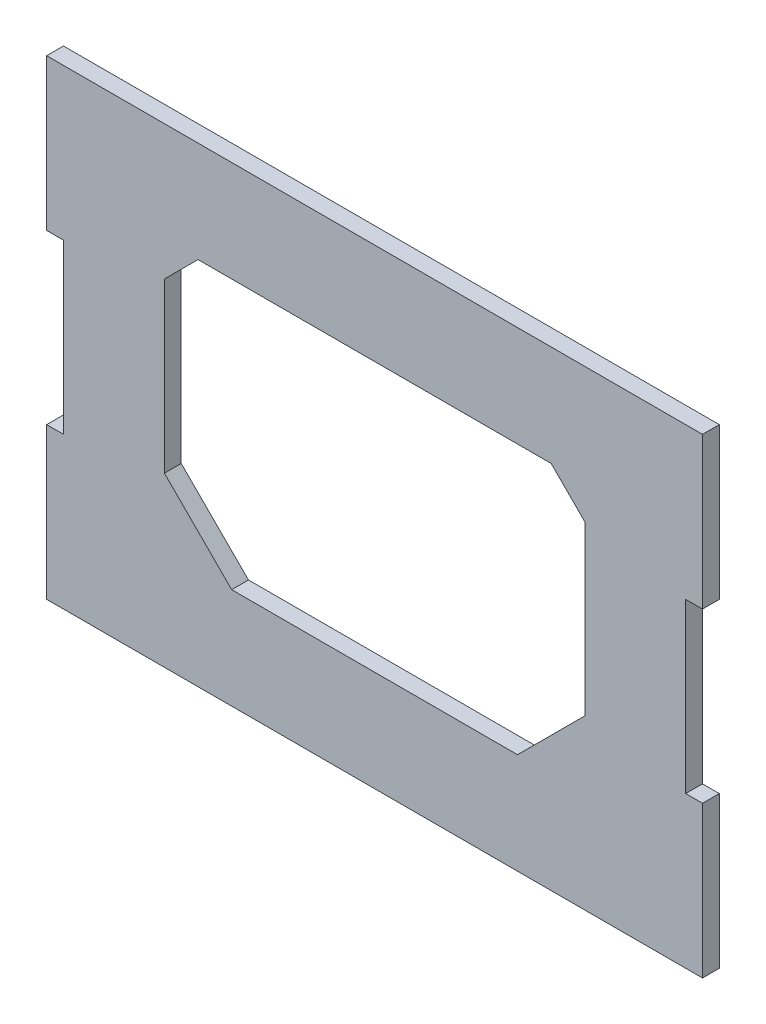
ISO-10303-21;
HEADER;
FILE_DESCRIPTION(('STEP AP214'),'2;1');
FILE_NAME('part.step','',(''),(''),'','','');
FILE_SCHEMA(('AUTOMOTIVE_DESIGN { 1 0 10303 214 1 1 1 1 }'));
ENDSEC;
DATA;
#1=APPLICATION_CONTEXT('core data for automotive mechanical design processes');
#2=APPLICATION_PROTOCOL_DEFINITION('international standard','automotive_design',2000,#1);
#3=PRODUCT_CONTEXT('',#1,'mechanical');
#4=PRODUCT('Part','Part','',(#3));
#5=PRODUCT_RELATED_PRODUCT_CATEGORY('part','',(#4));
#6=PRODUCT_DEFINITION_FORMATION('','',#4);
#7=PRODUCT_DEFINITION_CONTEXT('part definition',#1,'design');
#8=PRODUCT_DEFINITION('design','',#6,#7);
#9=PRODUCT_DEFINITION_SHAPE('','',#8);
#10=(LENGTH_UNIT() NAMED_UNIT(*) SI_UNIT(.MILLI.,.METRE.));
#11=(NAMED_UNIT(*) PLANE_ANGLE_UNIT() SI_UNIT($,.RADIAN.));
#12=(NAMED_UNIT(*) SI_UNIT($,.STERADIAN.) SOLID_ANGLE_UNIT());
#13=UNCERTAINTY_MEASURE_WITH_UNIT(LENGTH_MEASURE(1.E-05),#10,'distance_accuracy_value','');
#14=(GEOMETRIC_REPRESENTATION_CONTEXT(3) GLOBAL_UNCERTAINTY_ASSIGNED_CONTEXT((#13)) GLOBAL_UNIT_ASSIGNED_CONTEXT((#10,
#11,#12)) REPRESENTATION_CONTEXT('',''));
#15=CARTESIAN_POINT('',(0.,0.,0.));
#16=DIRECTION('',(0.,0.,1.));
#17=DIRECTION('',(1.,0.,0.));
#18=AXIS2_PLACEMENT_3D('',#15,#16,#17);
#19=CARTESIAN_POINT('',(0.,0.,10.));
#20=DIRECTION('',(1.,0.,0.));
#21=DIRECTION('',(0.,0.,-1.));
#22=AXIS2_PLACEMENT_3D('',#19,#20,#21);
#23=PLANE('',#22);
#24=DIRECTION('',(0.,-1.,0.));
#25=VECTOR('',#24,1.);
#26=CARTESIAN_POINT('',(0.,0.,0.));
#27=LINE('',#26,#25);
#28=CARTESIAN_POINT('',(0.,90.,0.));
#29=VERTEX_POINT('',#28);
#30=CARTESIAN_POINT('',(0.,0.,0.));
#31=VERTEX_POINT('',#30);
#32=EDGE_CURVE('E226',#29,#31,#27,.T.);
#33=ORIENTED_EDGE('',*,*,#32,.T.);
#34=DIRECTION('',(0.,0.,-1.));
#35=VECTOR('',#34,1.);
#36=CARTESIAN_POINT('',(0.,0.,10.));
#37=LINE('',#36,#35);
#38=CARTESIAN_POINT('',(0.,0.,10.));
#39=VERTEX_POINT('',#38);
#40=EDGE_CURVE('E11',#39,#31,#37,.T.);
#41=ORIENTED_EDGE('',*,*,#40,.F.);
#42=DIRECTION('',(0.,-1.,0.));
#43=VECTOR('',#42,1.);
#44=CARTESIAN_POINT('',(0.,0.,10.));
#45=LINE('',#44,#43);
#46=CARTESIAN_POINT('',(0.,90.,10.));
#47=VERTEX_POINT('',#46);
#48=EDGE_CURVE('E238',#47,#39,#45,.T.);
#49=ORIENTED_EDGE('',*,*,#48,.F.);
#50=DIRECTION('',(0.,0.,-1.));
#51=VECTOR('',#50,1.);
#52=CARTESIAN_POINT('',(0.,90.,10.));
#53=LINE('',#52,#51);
#54=EDGE_CURVE('E264',#47,#29,#53,.T.);
#55=ORIENTED_EDGE('',*,*,#54,.T.);
#56=EDGE_LOOP('',(#33,#41,#49,#55));
#57=FACE_BOUND('',#56,.T.);
#58=ADVANCED_FACE('F33',(#57),#23,.F.);
#59=CARTESIAN_POINT('',(0.,0.,10.));
#60=DIRECTION('',(0.,1.,0.));
#61=DIRECTION('',(-1.,0.,0.));
#62=AXIS2_PLACEMENT_3D('',#59,#60,#61);
#63=PLANE('',#62);
#64=DIRECTION('',(1.,0.,0.));
#65=VECTOR('',#64,1.);
#66=CARTESIAN_POINT('',(0.,0.,0.));
#67=LINE('',#66,#65);
#68=CARTESIAN_POINT('',(390.,0.,0.));
#69=VERTEX_POINT('',#68);
#70=EDGE_CURVE('E267',#31,#69,#67,.T.);
#71=ORIENTED_EDGE('',*,*,#70,.T.);
#72=DIRECTION('',(0.,0.,-1.));
#73=VECTOR('',#72,1.);
#74=CARTESIAN_POINT('',(390.,0.,10.));
#75=LINE('',#74,#73);
#76=CARTESIAN_POINT('',(390.,0.,10.));
#77=VERTEX_POINT('',#76);
#78=EDGE_CURVE('E40',#77,#69,#75,.T.);
#79=ORIENTED_EDGE('',*,*,#78,.F.);
#80=DIRECTION('',(1.,0.,0.));
#81=VECTOR('',#80,1.);
#82=CARTESIAN_POINT('',(0.,0.,10.));
#83=LINE('',#82,#81);
#84=EDGE_CURVE('E241',#39,#77,#83,.T.);
#85=ORIENTED_EDGE('',*,*,#84,.F.);
#86=ORIENTED_EDGE('',*,*,#40,.T.);
#87=EDGE_LOOP('',(#71,#79,#85,#86));
#88=FACE_BOUND('',#87,.T.);
#89=ADVANCED_FACE('F342',(#88),#63,.F.);
#90=CARTESIAN_POINT('',(390.,0.,10.));
#91=DIRECTION('',(-1.,0.,0.));
#92=DIRECTION('',(0.,0.,1.));
#93=AXIS2_PLACEMENT_3D('',#90,#91,#92);
#94=PLANE('',#93);
#95=DIRECTION('',(0.,1.,0.));
#96=VECTOR('',#95,1.);
#97=CARTESIAN_POINT('',(390.,0.,0.));
#98=LINE('',#97,#96);
#99=CARTESIAN_POINT('',(390.,90.,0.));
#100=VERTEX_POINT('',#99);
#101=EDGE_CURVE('E269',#69,#100,#98,.T.);
#102=ORIENTED_EDGE('',*,*,#101,.T.);
#103=DIRECTION('',(0.,0.,-1.));
#104=VECTOR('',#103,1.);
#105=CARTESIAN_POINT('',(390.,90.,10.));
#106=LINE('',#105,#104);
#107=CARTESIAN_POINT('',(390.,90.,10.));
#108=VERTEX_POINT('',#107);
#109=EDGE_CURVE('E314',#108,#100,#106,.T.);
#110=ORIENTED_EDGE('',*,*,#109,.F.);
#111=DIRECTION('',(0.,1.,0.));
#112=VECTOR('',#111,1.);
#113=CARTESIAN_POINT('',(390.,0.,10.));
#114=LINE('',#113,#112);
#115=EDGE_CURVE('E244',#77,#108,#114,.T.);
#116=ORIENTED_EDGE('',*,*,#115,.F.);
#117=ORIENTED_EDGE('',*,*,#78,.T.);
#118=EDGE_LOOP('',(#102,#110,#116,#117));
#119=FACE_BOUND('',#118,.T.);
#120=ADVANCED_FACE('F321',(#119),#94,.F.);
#121=CARTESIAN_POINT('',(390.,90.,10.));
#122=DIRECTION('',(0.,-1.,0.));
#123=DIRECTION('',(1.,0.,0.));
#124=AXIS2_PLACEMENT_3D('',#121,#122,#123);
#125=PLANE('',#124);
#126=DIRECTION('',(-1.,0.,0.));
#127=VECTOR('',#126,1.);
#128=CARTESIAN_POINT('',(390.,90.,0.));
#129=LINE('',#128,#127);
#130=CARTESIAN_POINT('',(380.,90.,0.));
#131=VERTEX_POINT('',#130);
#132=EDGE_CURVE('E271',#100,#131,#129,.T.);
#133=ORIENTED_EDGE('',*,*,#132,.T.);
#134=DIRECTION('',(0.,0.,-1.));
#135=VECTOR('',#134,1.);
#136=CARTESIAN_POINT('',(380.,90.,10.));
#137=LINE('',#136,#135);
#138=CARTESIAN_POINT('',(380.,90.,10.));
#139=VERTEX_POINT('',#138);
#140=EDGE_CURVE('E311',#139,#131,#137,.T.);
#141=ORIENTED_EDGE('',*,*,#140,.F.);
#142=DIRECTION('',(-1.,0.,0.));
#143=VECTOR('',#142,1.);
#144=CARTESIAN_POINT('',(390.,90.,10.));
#145=LINE('',#144,#143);
#146=EDGE_CURVE('E246',#108,#139,#145,.T.);
#147=ORIENTED_EDGE('',*,*,#146,.F.);
#148=ORIENTED_EDGE('',*,*,#109,.T.);
#149=EDGE_LOOP('',(#133,#141,#147,#148));
#150=FACE_BOUND('',#149,.T.);
#151=ADVANCED_FACE('F330',(#150),#125,.F.);
#152=CARTESIAN_POINT('',(380.,90.,10.));
#153=DIRECTION('',(-1.,0.,0.));
#154=DIRECTION('',(0.,0.,1.));
#155=AXIS2_PLACEMENT_3D('',#152,#153,#154);
#156=PLANE('',#155);
#157=DIRECTION('',(0.,1.,0.));
#158=VECTOR('',#157,1.);
#159=CARTESIAN_POINT('',(380.,90.,0.));
#160=LINE('',#159,#158);
#161=CARTESIAN_POINT('',(380.,190.,0.));
#162=VERTEX_POINT('',#161);
#163=EDGE_CURVE('E273',#131,#162,#160,.T.);
#164=ORIENTED_EDGE('',*,*,#163,.T.);
#165=DIRECTION('',(0.,0.,-1.));
#166=VECTOR('',#165,1.);
#167=CARTESIAN_POINT('',(380.,190.,10.));
#168=LINE('',#167,#166);
#169=CARTESIAN_POINT('',(380.,190.,10.));
#170=VERTEX_POINT('',#169);
#171=EDGE_CURVE('E308',#170,#162,#168,.T.);
#172=ORIENTED_EDGE('',*,*,#171,.F.);
#173=DIRECTION('',(0.,1.,0.));
#174=VECTOR('',#173,1.);
#175=CARTESIAN_POINT('',(380.,90.,10.));
#176=LINE('',#175,#174);
#177=EDGE_CURVE('E248',#139,#170,#176,.T.);
#178=ORIENTED_EDGE('',*,*,#177,.F.);
#179=ORIENTED_EDGE('',*,*,#140,.T.);
#180=EDGE_LOOP('',(#164,#172,#178,#179));
#181=FACE_BOUND('',#180,.T.);
#182=ADVANCED_FACE('F334',(#181),#156,.F.);
#183=CARTESIAN_POINT('',(390.,190.,10.));
#184=DIRECTION('',(0.,1.,0.));
#185=DIRECTION('',(-1.,0.,0.));
#186=AXIS2_PLACEMENT_3D('',#183,#184,#185);
#187=PLANE('',#186);
#188=DIRECTION('',(1.,0.,0.));
#189=VECTOR('',#188,1.);
#190=CARTESIAN_POINT('',(390.,190.,0.));
#191=LINE('',#190,#189);
#192=CARTESIAN_POINT('',(390.,190.,0.));
#193=VERTEX_POINT('',#192);
#194=EDGE_CURVE('E275',#162,#193,#191,.T.);
#195=ORIENTED_EDGE('',*,*,#194,.T.);
#196=DIRECTION('',(0.,0.,-1.));
#197=VECTOR('',#196,1.);
#198=CARTESIAN_POINT('',(390.,190.,10.));
#199=LINE('',#198,#197);
#200=CARTESIAN_POINT('',(390.,190.,10.));
#201=VERTEX_POINT('',#200);
#202=EDGE_CURVE('E305',#201,#193,#199,.T.);
#203=ORIENTED_EDGE('',*,*,#202,.F.);
#204=DIRECTION('',(1.,0.,0.));
#205=VECTOR('',#204,1.);
#206=CARTESIAN_POINT('',(390.,190.,10.));
#207=LINE('',#206,#205);
#208=EDGE_CURVE('E250',#170,#201,#207,.T.);
#209=ORIENTED_EDGE('',*,*,#208,.F.);
#210=ORIENTED_EDGE('',*,*,#171,.T.);
#211=EDGE_LOOP('',(#195,#203,#209,#210));
#212=FACE_BOUND('',#211,.T.);
#213=ADVANCED_FACE('F375',(#212),#187,.F.);
#214=CARTESIAN_POINT('',(390.,280.,10.));
#215=DIRECTION('',(-1.,0.,0.));
#216=DIRECTION('',(0.,-1.,0.));
#217=AXIS2_PLACEMENT_3D('',#214,#215,#216);
#218=PLANE('',#217);
#219=DIRECTION('',(0.,1.,0.));
#220=VECTOR('',#219,1.);
#221=CARTESIAN_POINT('',(390.,280.,0.));
#222=LINE('',#221,#220);
#223=CARTESIAN_POINT('',(390.,280.,0.));
#224=VERTEX_POINT('',#223);
#225=EDGE_CURVE('E277',#193,#224,#222,.T.);
#226=ORIENTED_EDGE('',*,*,#225,.T.);
#227=DIRECTION('',(0.,0.,-1.));
#228=VECTOR('',#227,1.);
#229=CARTESIAN_POINT('',(390.,280.,10.));
#230=LINE('',#229,#228);
#231=CARTESIAN_POINT('',(390.,280.,10.));
#232=VERTEX_POINT('',#231);
#233=EDGE_CURVE('E302',#232,#224,#230,.T.);
#234=ORIENTED_EDGE('',*,*,#233,.F.);
#235=DIRECTION('',(0.,1.,0.));
#236=VECTOR('',#235,1.);
#237=CARTESIAN_POINT('',(390.,280.,10.));
#238=LINE('',#237,#236);
#239=EDGE_CURVE('E252',#201,#232,#238,.T.);
#240=ORIENTED_EDGE('',*,*,#239,.F.);
#241=ORIENTED_EDGE('',*,*,#202,.T.);
#242=EDGE_LOOP('',(#226,#234,#240,#241));
#243=FACE_BOUND('',#242,.T.);
#244=ADVANCED_FACE('F373',(#243),#218,.F.);
#245=CARTESIAN_POINT('',(0.,280.,10.));
#246=DIRECTION('',(0.,-1.,0.));
#247=DIRECTION('',(0.,0.,-1.));
#248=AXIS2_PLACEMENT_3D('',#245,#246,#247);
#249=PLANE('',#248);
#250=DIRECTION('',(-1.,0.,0.));
#251=VECTOR('',#250,1.);
#252=CARTESIAN_POINT('',(0.,280.,0.));
#253=LINE('',#252,#251);
#254=CARTESIAN_POINT('',(0.,280.,0.));
#255=VERTEX_POINT('',#254);
#256=EDGE_CURVE('E279',#224,#255,#253,.T.);
#257=ORIENTED_EDGE('',*,*,#256,.T.);
#258=DIRECTION('',(0.,0.,-1.));
#259=VECTOR('',#258,1.);
#260=CARTESIAN_POINT('',(0.,280.,10.));
#261=LINE('',#260,#259);
#262=CARTESIAN_POINT('',(0.,280.,10.));
#263=VERTEX_POINT('',#262);
#264=EDGE_CURVE('E299',#263,#255,#261,.T.);
#265=ORIENTED_EDGE('',*,*,#264,.F.);
#266=DIRECTION('',(-1.,0.,0.));
#267=VECTOR('',#266,1.);
#268=CARTESIAN_POINT('',(0.,280.,10.));
#269=LINE('',#268,#267);
#270=EDGE_CURVE('E254',#232,#263,#269,.T.);
#271=ORIENTED_EDGE('',*,*,#270,.F.);
#272=ORIENTED_EDGE('',*,*,#233,.T.);
#273=EDGE_LOOP('',(#257,#265,#271,#272));
#274=FACE_BOUND('',#273,.T.);
#275=ADVANCED_FACE('F369',(#274),#249,.F.);
#276=CARTESIAN_POINT('',(0.,280.,10.));
#277=DIRECTION('',(1.,0.,0.));
#278=DIRECTION('',(0.,1.,0.));
#279=AXIS2_PLACEMENT_3D('',#276,#277,#278);
#280=PLANE('',#279);
#281=DIRECTION('',(0.,-1.,0.));
#282=VECTOR('',#281,1.);
#283=CARTESIAN_POINT('',(0.,280.,0.));
#284=LINE('',#283,#282);
#285=CARTESIAN_POINT('',(0.,190.,0.));
#286=VERTEX_POINT('',#285);
#287=EDGE_CURVE('E281',#255,#286,#284,.T.);
#288=ORIENTED_EDGE('',*,*,#287,.T.);
#289=DIRECTION('',(0.,0.,-1.));
#290=VECTOR('',#289,1.);
#291=CARTESIAN_POINT('',(0.,190.,10.));
#292=LINE('',#291,#290);
#293=CARTESIAN_POINT('',(0.,190.,10.));
#294=VERTEX_POINT('',#293);
#295=EDGE_CURVE('E296',#294,#286,#292,.T.);
#296=ORIENTED_EDGE('',*,*,#295,.F.);
#297=DIRECTION('',(0.,-1.,0.));
#298=VECTOR('',#297,1.);
#299=CARTESIAN_POINT('',(0.,280.,10.));
#300=LINE('',#299,#298);
#301=EDGE_CURVE('E256',#263,#294,#300,.T.);
#302=ORIENTED_EDGE('',*,*,#301,.F.);
#303=ORIENTED_EDGE('',*,*,#264,.T.);
#304=EDGE_LOOP('',(#288,#296,#302,#303));
#305=FACE_BOUND('',#304,.T.);
#306=ADVANCED_FACE('F364',(#305),#280,.F.);
#307=CARTESIAN_POINT('',(0.,190.,10.));
#308=DIRECTION('',(0.,1.,0.));
#309=DIRECTION('',(-1.,0.,0.));
#310=AXIS2_PLACEMENT_3D('',#307,#308,#309);
#311=PLANE('',#310);
#312=DIRECTION('',(1.,0.,0.));
#313=VECTOR('',#312,1.);
#314=CARTESIAN_POINT('',(0.,190.,0.));
#315=LINE('',#314,#313);
#316=CARTESIAN_POINT('',(10.,190.,0.));
#317=VERTEX_POINT('',#316);
#318=EDGE_CURVE('E283',#286,#317,#315,.T.);
#319=ORIENTED_EDGE('',*,*,#318,.T.);
#320=DIRECTION('',(0.,0.,-1.));
#321=VECTOR('',#320,1.);
#322=CARTESIAN_POINT('',(10.,190.,10.));
#323=LINE('',#322,#321);
#324=CARTESIAN_POINT('',(10.,190.,10.));
#325=VERTEX_POINT('',#324);
#326=EDGE_CURVE('E293',#325,#317,#323,.T.);
#327=ORIENTED_EDGE('',*,*,#326,.F.);
#328=DIRECTION('',(1.,0.,0.));
#329=VECTOR('',#328,1.);
#330=CARTESIAN_POINT('',(0.,190.,10.));
#331=LINE('',#330,#329);
#332=EDGE_CURVE('E258',#294,#325,#331,.T.);
#333=ORIENTED_EDGE('',*,*,#332,.F.);
#334=ORIENTED_EDGE('',*,*,#295,.T.);
#335=EDGE_LOOP('',(#319,#327,#333,#334));
#336=FACE_BOUND('',#335,.T.);
#337=ADVANCED_FACE('F358',(#336),#311,.F.);
#338=CARTESIAN_POINT('',(10.,89.9999999999999,10.));
#339=DIRECTION('',(1.,0.,0.));
#340=DIRECTION('',(0.,1.,0.));
#341=AXIS2_PLACEMENT_3D('',#338,#339,#340);
#342=PLANE('',#341);
#343=DIRECTION('',(0.,-1.,0.));
#344=VECTOR('',#343,1.);
#345=CARTESIAN_POINT('',(10.,89.9999999999999,0.));
#346=LINE('',#345,#344);
#347=CARTESIAN_POINT('',(10.,89.9999999999999,0.));
#348=VERTEX_POINT('',#347);
#349=EDGE_CURVE('E285',#317,#348,#346,.T.);
#350=ORIENTED_EDGE('',*,*,#349,.T.);
#351=DIRECTION('',(0.,0.,-1.));
#352=VECTOR('',#351,1.);
#353=CARTESIAN_POINT('',(10.,89.9999999999999,10.));
#354=LINE('',#353,#352);
#355=CARTESIAN_POINT('',(10.,89.9999999999999,10.));
#356=VERTEX_POINT('',#355);
#357=EDGE_CURVE('E290',#356,#348,#354,.T.);
#358=ORIENTED_EDGE('',*,*,#357,.F.);
#359=DIRECTION('',(0.,-1.,0.));
#360=VECTOR('',#359,1.);
#361=CARTESIAN_POINT('',(10.,89.9999999999999,10.));
#362=LINE('',#361,#360);
#363=EDGE_CURVE('E260',#325,#356,#362,.T.);
#364=ORIENTED_EDGE('',*,*,#363,.F.);
#365=ORIENTED_EDGE('',*,*,#326,.T.);
#366=EDGE_LOOP('',(#350,#358,#364,#365));
#367=FACE_BOUND('',#366,.T.);
#368=ADVANCED_FACE('F354',(#367),#342,.F.);
#369=CARTESIAN_POINT('',(0.,90.,10.));
#370=DIRECTION('',(0.,-1.,0.));
#371=DIRECTION('',(1.,0.,0.));
#372=AXIS2_PLACEMENT_3D('',#369,#370,#371);
#373=PLANE('',#372);
#374=DIRECTION('',(-1.,0.,0.));
#375=VECTOR('',#374,1.);
#376=CARTESIAN_POINT('',(0.,90.,0.));
#377=LINE('',#376,#375);
#378=EDGE_CURVE('E242',#348,#29,#377,.T.);
#379=ORIENTED_EDGE('',*,*,#378,.T.);
#380=ORIENTED_EDGE('',*,*,#54,.F.);
#381=DIRECTION('',(-1.,0.,0.));
#382=VECTOR('',#381,1.);
#383=CARTESIAN_POINT('',(0.,90.,10.));
#384=LINE('',#383,#382);
#385=EDGE_CURVE('E262',#356,#47,#384,.T.);
#386=ORIENTED_EDGE('',*,*,#385,.F.);
#387=ORIENTED_EDGE('',*,*,#357,.T.);
#388=EDGE_LOOP('',(#379,#380,#386,#387));
#389=FACE_BOUND('',#388,.T.);
#390=ADVANCED_FACE('F349',(#389),#373,.F.);
#391=CARTESIAN_POINT('',(0.,0.,10.));
#392=DIRECTION('',(0.,0.,-1.));
#393=DIRECTION('',(-1.,0.,0.));
#394=AXIS2_PLACEMENT_3D('',#391,#392,#393);
#395=PLANE('',#394);
#396=DIRECTION('',(0.707106781186548,-0.707106781186547,0.));
#397=VECTOR('',#396,1.);
#398=CARTESIAN_POINT('',(70.,100.,10.));
#399=LINE('',#398,#397);
#400=CARTESIAN_POINT('',(70.0000000000001,100.,10.));
#401=VERTEX_POINT('',#400);
#402=CARTESIAN_POINT('',(110.,60.,10.));
#403=VERTEX_POINT('',#402);
#404=EDGE_CURVE('E208',#401,#403,#399,.T.);
#405=ORIENTED_EDGE('',*,*,#404,.F.);
#406=DIRECTION('',(0.,-1.,0.));
#407=VECTOR('',#406,1.);
#408=CARTESIAN_POINT('',(70.,200.,10.));
#409=LINE('',#408,#407);
#410=CARTESIAN_POINT('',(70.,200.,10.));
#411=VERTEX_POINT('',#410);
#412=EDGE_CURVE('E47',#411,#401,#409,.T.);
#413=ORIENTED_EDGE('',*,*,#412,.F.);
#414=DIRECTION('',(-0.707106781186548,-0.707106781186547,0.));
#415=VECTOR('',#414,1.);
#416=CARTESIAN_POINT('',(90.,220.,10.));
#417=LINE('',#416,#415);
#418=CARTESIAN_POINT('',(90.,220.,10.));
#419=VERTEX_POINT('',#418);
#420=EDGE_CURVE('E188',#419,#411,#417,.T.);
#421=ORIENTED_EDGE('',*,*,#420,.F.);
#422=DIRECTION('',(-1.,0.,0.));
#423=VECTOR('',#422,1.);
#424=CARTESIAN_POINT('',(300.,220.,10.));
#425=LINE('',#424,#423);
#426=CARTESIAN_POINT('',(300.,220.,10.));
#427=VERTEX_POINT('',#426);
#428=EDGE_CURVE('E191',#427,#419,#425,.T.);
#429=ORIENTED_EDGE('',*,*,#428,.F.);
#430=DIRECTION('',(-0.707106781186547,0.707106781186548,0.));
#431=VECTOR('',#430,1.);
#432=CARTESIAN_POINT('',(320.,200.,10.));
#433=LINE('',#432,#431);
#434=CARTESIAN_POINT('',(320.,200.,10.));
#435=VERTEX_POINT('',#434);
#436=EDGE_CURVE('E219',#435,#427,#433,.T.);
#437=ORIENTED_EDGE('',*,*,#436,.F.);
#438=DIRECTION('',(0.,1.,0.));
#439=VECTOR('',#438,1.);
#440=CARTESIAN_POINT('',(320.,100.,10.));
#441=LINE('',#440,#439);
#442=CARTESIAN_POINT('',(320.,100.,10.));
#443=VERTEX_POINT('',#442);
#444=EDGE_CURVE('E216',#443,#435,#441,.T.);
#445=ORIENTED_EDGE('',*,*,#444,.F.);
#446=DIRECTION('',(0.707106781186547,0.707106781186548,0.));
#447=VECTOR('',#446,1.);
#448=CARTESIAN_POINT('',(280.,60.,10.));
#449=LINE('',#448,#447);
#450=CARTESIAN_POINT('',(280.,60.,10.));
#451=VERTEX_POINT('',#450);
#452=EDGE_CURVE('E213',#451,#443,#449,.T.);
#453=ORIENTED_EDGE('',*,*,#452,.F.);
#454=DIRECTION('',(1.,0.,0.));
#455=VECTOR('',#454,1.);
#456=CARTESIAN_POINT('',(110.,60.,10.));
#457=LINE('',#456,#455);
#458=EDGE_CURVE('E210',#403,#451,#457,.T.);
#459=ORIENTED_EDGE('',*,*,#458,.F.);
#460=EDGE_LOOP('',(#405,#413,#421,#429,#437,#445,#453,#459));
#461=FACE_BOUND('',#460,.T.);
#462=ORIENTED_EDGE('',*,*,#48,.T.);
#463=ORIENTED_EDGE('',*,*,#84,.T.);
#464=ORIENTED_EDGE('',*,*,#115,.T.);
#465=ORIENTED_EDGE('',*,*,#146,.T.);
#466=ORIENTED_EDGE('',*,*,#177,.T.);
#467=ORIENTED_EDGE('',*,*,#208,.T.);
#468=ORIENTED_EDGE('',*,*,#239,.T.);
#469=ORIENTED_EDGE('',*,*,#270,.T.);
#470=ORIENTED_EDGE('',*,*,#301,.T.);
#471=ORIENTED_EDGE('',*,*,#332,.T.);
#472=ORIENTED_EDGE('',*,*,#363,.T.);
#473=ORIENTED_EDGE('',*,*,#385,.T.);
#474=EDGE_LOOP('',(#462,#463,#464,#465,#466,#467,#468,#469,#470,#471,#472,#473));
#475=FACE_BOUND('',#474,.T.);
#476=ADVANCED_FACE('F338',(#461,#475),#395,.F.);
#477=CARTESIAN_POINT('',(0.,0.,0.));
#478=DIRECTION('',(0.,0.,-1.));
#479=DIRECTION('',(-1.,0.,0.));
#480=AXIS2_PLACEMENT_3D('',#477,#478,#479);
#481=PLANE('',#480);
#482=DIRECTION('',(0.,-1.,0.));
#483=VECTOR('',#482,1.);
#484=CARTESIAN_POINT('',(70.,200.,0.));
#485=LINE('',#484,#483);
#486=CARTESIAN_POINT('',(70.,200.,0.));
#487=VERTEX_POINT('',#486);
#488=CARTESIAN_POINT('',(70.,100.,0.));
#489=VERTEX_POINT('',#488);
#490=EDGE_CURVE('E171',#487,#489,#485,.T.);
#491=ORIENTED_EDGE('',*,*,#490,.T.);
#492=DIRECTION('',(0.707106781186548,-0.707106781186547,0.));
#493=VECTOR('',#492,1.);
#494=CARTESIAN_POINT('',(70.,100.,0.));
#495=LINE('',#494,#493);
#496=CARTESIAN_POINT('',(110.,60.,0.));
#497=VERTEX_POINT('',#496);
#498=EDGE_CURVE('E180',#489,#497,#495,.T.);
#499=ORIENTED_EDGE('',*,*,#498,.T.);
#500=DIRECTION('',(1.,0.,0.));
#501=VECTOR('',#500,1.);
#502=CARTESIAN_POINT('',(110.,60.,0.));
#503=LINE('',#502,#501);
#504=CARTESIAN_POINT('',(280.,60.,0.));
#505=VERTEX_POINT('',#504);
#506=EDGE_CURVE('E55',#497,#505,#503,.T.);
#507=ORIENTED_EDGE('',*,*,#506,.T.);
#508=DIRECTION('',(0.707106781186547,0.707106781186548,0.));
#509=VECTOR('',#508,1.);
#510=CARTESIAN_POINT('',(280.,60.,0.));
#511=LINE('',#510,#509);
#512=CARTESIAN_POINT('',(320.,100.,0.));
#513=VERTEX_POINT('',#512);
#514=EDGE_CURVE('E195',#505,#513,#511,.T.);
#515=ORIENTED_EDGE('',*,*,#514,.T.);
#516=DIRECTION('',(0.,1.,0.));
#517=VECTOR('',#516,1.);
#518=CARTESIAN_POINT('',(320.,100.,0.));
#519=LINE('',#518,#517);
#520=CARTESIAN_POINT('',(320.,200.,0.));
#521=VERTEX_POINT('',#520);
#522=EDGE_CURVE('E198',#513,#521,#519,.T.);
#523=ORIENTED_EDGE('',*,*,#522,.T.);
#524=DIRECTION('',(-0.707106781186547,0.707106781186548,0.));
#525=VECTOR('',#524,1.);
#526=CARTESIAN_POINT('',(320.,200.,0.));
#527=LINE('',#526,#525);
#528=CARTESIAN_POINT('',(300.,220.,0.));
#529=VERTEX_POINT('',#528);
#530=EDGE_CURVE('E201',#521,#529,#527,.T.);
#531=ORIENTED_EDGE('',*,*,#530,.T.);
#532=DIRECTION('',(-1.,0.,0.));
#533=VECTOR('',#532,1.);
#534=CARTESIAN_POINT('',(300.,220.,0.));
#535=LINE('',#534,#533);
#536=CARTESIAN_POINT('',(90.,220.,0.));
#537=VERTEX_POINT('',#536);
#538=EDGE_CURVE('E204',#529,#537,#535,.T.);
#539=ORIENTED_EDGE('',*,*,#538,.T.);
#540=DIRECTION('',(-0.707106781186548,-0.707106781186547,0.));
#541=VECTOR('',#540,1.);
#542=CARTESIAN_POINT('',(90.,220.,0.));
#543=LINE('',#542,#541);
#544=EDGE_CURVE('E177',#537,#487,#543,.T.);
#545=ORIENTED_EDGE('',*,*,#544,.T.);
#546=EDGE_LOOP('',(#491,#499,#507,#515,#523,#531,#539,#545));
#547=FACE_BOUND('',#546,.T.);
#548=ORIENTED_EDGE('',*,*,#32,.F.);
#549=ORIENTED_EDGE('',*,*,#378,.F.);
#550=ORIENTED_EDGE('',*,*,#349,.F.);
#551=ORIENTED_EDGE('',*,*,#318,.F.);
#552=ORIENTED_EDGE('',*,*,#287,.F.);
#553=ORIENTED_EDGE('',*,*,#256,.F.);
#554=ORIENTED_EDGE('',*,*,#225,.F.);
#555=ORIENTED_EDGE('',*,*,#194,.F.);
#556=ORIENTED_EDGE('',*,*,#163,.F.);
#557=ORIENTED_EDGE('',*,*,#132,.F.);
#558=ORIENTED_EDGE('',*,*,#101,.F.);
#559=ORIENTED_EDGE('',*,*,#70,.F.);
#560=EDGE_LOOP('',(#548,#549,#550,#551,#552,#553,#554,#555,#556,#557,#558,#559));
#561=FACE_BOUND('',#560,.T.);
#562=ADVANCED_FACE('F184',(#547,#561),#481,.T.);
#563=CARTESIAN_POINT('',(70.,200.,0.));
#564=DIRECTION('',(-1.,0.,0.));
#565=DIRECTION('',(0.,-1.,0.));
#566=AXIS2_PLACEMENT_3D('',#563,#564,#565);
#567=PLANE('',#566);
#568=ORIENTED_EDGE('',*,*,#412,.T.);
#569=DIRECTION('',(0.,0.,1.));
#570=VECTOR('',#569,1.);
#571=CARTESIAN_POINT('',(70.,100.,0.));
#572=LINE('',#571,#570);
#573=EDGE_CURVE('E167',#489,#401,#572,.T.);
#574=ORIENTED_EDGE('',*,*,#573,.F.);
#575=ORIENTED_EDGE('',*,*,#490,.F.);
#576=DIRECTION('',(0.,0.,1.));
#577=VECTOR('',#576,1.);
#578=CARTESIAN_POINT('',(70.,200.,0.));
#579=LINE('',#578,#577);
#580=EDGE_CURVE('E224',#487,#411,#579,.T.);
#581=ORIENTED_EDGE('',*,*,#580,.T.);
#582=EDGE_LOOP('',(#568,#574,#575,#581));
#583=FACE_BOUND('',#582,.T.);
#584=ADVANCED_FACE('F169',(#583),#567,.F.);
#585=CARTESIAN_POINT('',(90.,220.,0.));
#586=DIRECTION('',(-0.707106781186547,0.707106781186548,0.));
#587=DIRECTION('',(-0.707106781186548,-0.707106781186547,0.));
#588=AXIS2_PLACEMENT_3D('',#585,#586,#587);
#589=PLANE('',#588);
#590=ORIENTED_EDGE('',*,*,#420,.T.);
#591=ORIENTED_EDGE('',*,*,#580,.F.);
#592=ORIENTED_EDGE('',*,*,#544,.F.);
#593=DIRECTION('',(0.,0.,1.));
#594=VECTOR('',#593,1.);
#595=CARTESIAN_POINT('',(90.,220.,0.));
#596=LINE('',#595,#594);
#597=EDGE_CURVE('E227',#537,#419,#596,.T.);
#598=ORIENTED_EDGE('',*,*,#597,.T.);
#599=EDGE_LOOP('',(#590,#591,#592,#598));
#600=FACE_BOUND('',#599,.T.);
#601=ADVANCED_FACE('F478',(#600),#589,.F.);
#602=CARTESIAN_POINT('',(300.,220.,0.));
#603=DIRECTION('',(0.,1.,0.));
#604=DIRECTION('',(-1.,0.,0.));
#605=AXIS2_PLACEMENT_3D('',#602,#603,#604);
#606=PLANE('',#605);
#607=ORIENTED_EDGE('',*,*,#428,.T.);
#608=ORIENTED_EDGE('',*,*,#597,.F.);
#609=ORIENTED_EDGE('',*,*,#538,.F.);
#610=DIRECTION('',(0.,0.,1.));
#611=VECTOR('',#610,1.);
#612=CARTESIAN_POINT('',(300.,220.,0.));
#613=LINE('',#612,#611);
#614=EDGE_CURVE('E229',#529,#427,#613,.T.);
#615=ORIENTED_EDGE('',*,*,#614,.T.);
#616=EDGE_LOOP('',(#607,#608,#609,#615));
#617=FACE_BOUND('',#616,.T.);
#618=ADVANCED_FACE('F487',(#617),#606,.F.);
#619=CARTESIAN_POINT('',(320.,200.,0.));
#620=DIRECTION('',(0.707106781186548,0.707106781186547,0.));
#621=DIRECTION('',(-0.707106781186547,0.707106781186548,0.));
#622=AXIS2_PLACEMENT_3D('',#619,#620,#621);
#623=PLANE('',#622);
#624=ORIENTED_EDGE('',*,*,#436,.T.);
#625=ORIENTED_EDGE('',*,*,#614,.F.);
#626=ORIENTED_EDGE('',*,*,#530,.F.);
#627=DIRECTION('',(0.,0.,1.));
#628=VECTOR('',#627,1.);
#629=CARTESIAN_POINT('',(320.,200.,0.));
#630=LINE('',#629,#628);
#631=EDGE_CURVE('E231',#521,#435,#630,.T.);
#632=ORIENTED_EDGE('',*,*,#631,.T.);
#633=EDGE_LOOP('',(#624,#625,#626,#632));
#634=FACE_BOUND('',#633,.T.);
#635=ADVANCED_FACE('F497',(#634),#623,.F.);
#636=CARTESIAN_POINT('',(320.,100.,0.));
#637=DIRECTION('',(1.,0.,0.));
#638=DIRECTION('',(0.,1.,0.));
#639=AXIS2_PLACEMENT_3D('',#636,#637,#638);
#640=PLANE('',#639);
#641=ORIENTED_EDGE('',*,*,#444,.T.);
#642=ORIENTED_EDGE('',*,*,#631,.F.);
#643=ORIENTED_EDGE('',*,*,#522,.F.);
#644=DIRECTION('',(0.,0.,1.));
#645=VECTOR('',#644,1.);
#646=CARTESIAN_POINT('',(320.,100.,0.));
#647=LINE('',#646,#645);
#648=EDGE_CURVE('E233',#513,#443,#647,.T.);
#649=ORIENTED_EDGE('',*,*,#648,.T.);
#650=EDGE_LOOP('',(#641,#642,#643,#649));
#651=FACE_BOUND('',#650,.T.);
#652=ADVANCED_FACE('F507',(#651),#640,.F.);
#653=CARTESIAN_POINT('',(280.,60.,0.));
#654=DIRECTION('',(0.707106781186548,-0.707106781186547,0.));
#655=DIRECTION('',(0.707106781186547,0.707106781186548,0.));
#656=AXIS2_PLACEMENT_3D('',#653,#654,#655);
#657=PLANE('',#656);
#658=ORIENTED_EDGE('',*,*,#452,.T.);
#659=ORIENTED_EDGE('',*,*,#648,.F.);
#660=ORIENTED_EDGE('',*,*,#514,.F.);
#661=DIRECTION('',(0.,0.,1.));
#662=VECTOR('',#661,1.);
#663=CARTESIAN_POINT('',(280.,60.,0.));
#664=LINE('',#663,#662);
#665=EDGE_CURVE('E235',#505,#451,#664,.T.);
#666=ORIENTED_EDGE('',*,*,#665,.T.);
#667=EDGE_LOOP('',(#658,#659,#660,#666));
#668=FACE_BOUND('',#667,.T.);
#669=ADVANCED_FACE('F517',(#668),#657,.F.);
#670=CARTESIAN_POINT('',(110.,60.,0.));
#671=DIRECTION('',(0.,-1.,0.));
#672=DIRECTION('',(1.,0.,0.));
#673=AXIS2_PLACEMENT_3D('',#670,#671,#672);
#674=PLANE('',#673);
#675=ORIENTED_EDGE('',*,*,#458,.T.);
#676=ORIENTED_EDGE('',*,*,#665,.F.);
#677=ORIENTED_EDGE('',*,*,#506,.F.);
#678=DIRECTION('',(0.,0.,1.));
#679=VECTOR('',#678,1.);
#680=CARTESIAN_POINT('',(110.,60.,0.));
#681=LINE('',#680,#679);
#682=EDGE_CURVE('E176',#497,#403,#681,.T.);
#683=ORIENTED_EDGE('',*,*,#682,.T.);
#684=EDGE_LOOP('',(#675,#676,#677,#683));
#685=FACE_BOUND('',#684,.T.);
#686=ADVANCED_FACE('F527',(#685),#674,.F.);
#687=CARTESIAN_POINT('',(70.,100.,0.));
#688=DIRECTION('',(-0.707106781186547,-0.707106781186548,0.));
#689=DIRECTION('',(0.707106781186548,-0.707106781186547,0.));
#690=AXIS2_PLACEMENT_3D('',#687,#688,#689);
#691=PLANE('',#690);
#692=ORIENTED_EDGE('',*,*,#404,.T.);
#693=ORIENTED_EDGE('',*,*,#682,.F.);
#694=ORIENTED_EDGE('',*,*,#498,.F.);
#695=ORIENTED_EDGE('',*,*,#573,.T.);
#696=EDGE_LOOP('',(#692,#693,#694,#695));
#697=FACE_BOUND('',#696,.T.);
#698=ADVANCED_FACE('F181',(#697),#691,.F.);
#699=CLOSED_SHELL('',(#58,#89,#120,#151,#182,#213,#244,#275,#306,#337,#368,#390,#476,#562,#584,
#601,#618,#635,#652,#669,#686,#698));
#700=MANIFOLD_SOLID_BREP('B2',#699);
#701=ADVANCED_BREP_SHAPE_REPRESENTATION('',(#18,#700),#14);
#702=SHAPE_DEFINITION_REPRESENTATION(#9,#701);
ENDSEC;
END-ISO-10303-21;
